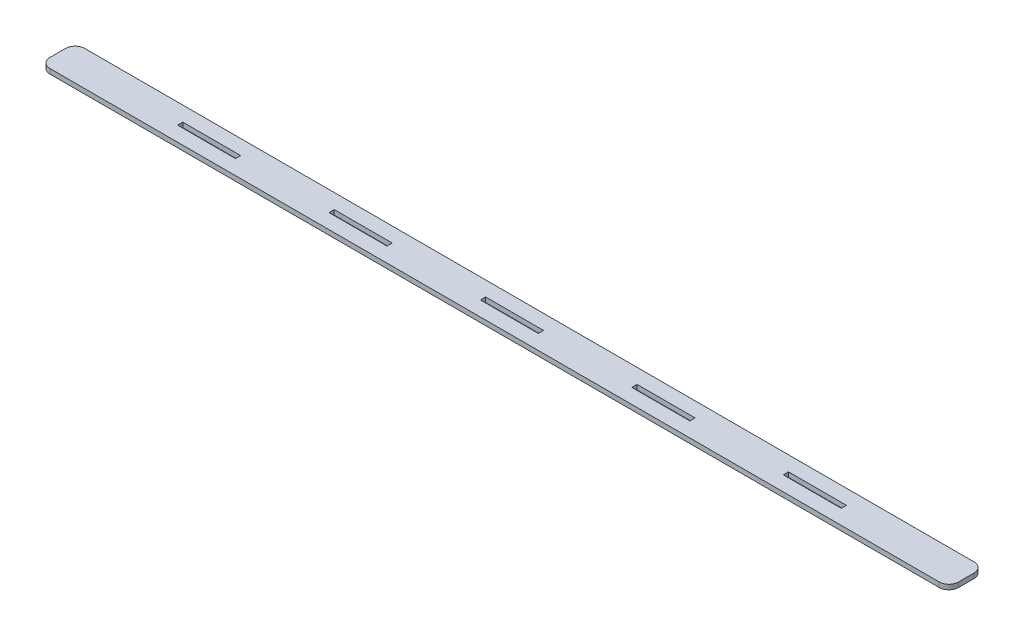
ISO-10303-21;
HEADER;
FILE_DESCRIPTION(('STEP AP214'),'2;1');
FILE_NAME('part.step','',(''),(''),'','','');
FILE_SCHEMA(('AUTOMOTIVE_DESIGN { 1 0 10303 214 1 1 1 1 }'));
ENDSEC;
DATA;
#1=APPLICATION_CONTEXT('core data for automotive mechanical design processes');
#2=APPLICATION_PROTOCOL_DEFINITION('international standard','automotive_design',2000,#1);
#3=PRODUCT_CONTEXT('',#1,'mechanical');
#4=PRODUCT('Part','Part','',(#3));
#5=PRODUCT_RELATED_PRODUCT_CATEGORY('part','',(#4));
#6=PRODUCT_DEFINITION_FORMATION('','',#4);
#7=PRODUCT_DEFINITION_CONTEXT('part definition',#1,'design');
#8=PRODUCT_DEFINITION('design','',#6,#7);
#9=PRODUCT_DEFINITION_SHAPE('','',#8);
#10=(LENGTH_UNIT() NAMED_UNIT(*) SI_UNIT(.MILLI.,.METRE.));
#11=(NAMED_UNIT(*) PLANE_ANGLE_UNIT() SI_UNIT($,.RADIAN.));
#12=(NAMED_UNIT(*) SI_UNIT($,.STERADIAN.) SOLID_ANGLE_UNIT());
#13=UNCERTAINTY_MEASURE_WITH_UNIT(LENGTH_MEASURE(1.E-05),#10,'distance_accuracy_value','');
#14=(GEOMETRIC_REPRESENTATION_CONTEXT(3) GLOBAL_UNCERTAINTY_ASSIGNED_CONTEXT((#13)) GLOBAL_UNIT_ASSIGNED_CONTEXT((#10,
#11,#12)) REPRESENTATION_CONTEXT('',''));
#15=CARTESIAN_POINT('',(0.,0.,0.));
#16=DIRECTION('',(0.,0.,1.));
#17=DIRECTION('',(1.,0.,0.));
#18=AXIS2_PLACEMENT_3D('',#15,#16,#17);
#19=CARTESIAN_POINT('',(-298.45,3.175,11.43));
#20=DIRECTION('',(1.,0.,0.));
#21=DIRECTION('',(0.,0.,-1.));
#22=AXIS2_PLACEMENT_3D('',#19,#20,#21);
#23=PLANE('',#22);
#24=DIRECTION('',(0.,0.,1.));
#25=VECTOR('',#24,1.);
#26=CARTESIAN_POINT('',(-298.45,0.,11.43));
#27=LINE('',#26,#25);
#28=CARTESIAN_POINT('',(-298.45,0.,-5.07999999999997));
#29=VERTEX_POINT('',#28);
#30=CARTESIAN_POINT('',(-298.45,0.,5.08000000000003));
#31=VERTEX_POINT('',#30);
#32=EDGE_CURVE('E266',#29,#31,#27,.T.);
#33=ORIENTED_EDGE('',*,*,#32,.T.);
#34=DIRECTION('',(0.,-1.,0.));
#35=VECTOR('',#34,1.);
#36=CARTESIAN_POINT('',(-298.45,3.175,5.08000000000003));
#37=LINE('',#36,#35);
#38=CARTESIAN_POINT('',(-298.45,3.175,5.08000000000003));
#39=VERTEX_POINT('',#38);
#40=EDGE_CURVE('E11',#31,#39,#37,.F.);
#41=ORIENTED_EDGE('',*,*,#40,.T.);
#42=DIRECTION('',(0.,0.,1.));
#43=VECTOR('',#42,1.);
#44=CARTESIAN_POINT('',(-298.45,3.175,11.43));
#45=LINE('',#44,#43);
#46=CARTESIAN_POINT('',(-298.45,3.175,-5.07999999999997));
#47=VERTEX_POINT('',#46);
#48=EDGE_CURVE('E397',#47,#39,#45,.T.);
#49=ORIENTED_EDGE('',*,*,#48,.F.);
#50=DIRECTION('',(0.,-1.,0.));
#51=VECTOR('',#50,1.);
#52=CARTESIAN_POINT('',(-298.45,3.175,-5.07999999999997));
#53=LINE('',#52,#51);
#54=EDGE_CURVE('E47',#47,#29,#53,.T.);
#55=ORIENTED_EDGE('',*,*,#54,.T.);
#56=EDGE_LOOP('',(#33,#41,#49,#55));
#57=FACE_BOUND('',#56,.T.);
#58=ADVANCED_FACE('F39',(#57),#23,.F.);
#59=CARTESIAN_POINT('',(298.45,3.175,11.43));
#60=DIRECTION('',(0.,0.,-1.));
#61=DIRECTION('',(-1.,0.,0.));
#62=AXIS2_PLACEMENT_3D('',#59,#60,#61);
#63=PLANE('',#62);
#64=DIRECTION('',(1.,0.,0.));
#65=VECTOR('',#64,1.);
#66=CARTESIAN_POINT('',(298.45,0.,11.43));
#67=LINE('',#66,#65);
#68=CARTESIAN_POINT('',(-292.1,0.,11.43));
#69=VERTEX_POINT('',#68);
#70=CARTESIAN_POINT('',(292.1,0.,11.43));
#71=VERTEX_POINT('',#70);
#72=EDGE_CURVE('E411',#69,#71,#67,.T.);
#73=ORIENTED_EDGE('',*,*,#72,.T.);
#74=DIRECTION('',(0.,-1.,0.));
#75=VECTOR('',#74,1.);
#76=CARTESIAN_POINT('',(292.1,3.175,11.43));
#77=LINE('',#76,#75);
#78=CARTESIAN_POINT('',(292.1,3.175,11.43));
#79=VERTEX_POINT('',#78);
#80=EDGE_CURVE('E433',#71,#79,#77,.F.);
#81=ORIENTED_EDGE('',*,*,#80,.T.);
#82=DIRECTION('',(1.,0.,0.));
#83=VECTOR('',#82,1.);
#84=CARTESIAN_POINT('',(298.45,3.175,11.43));
#85=LINE('',#84,#83);
#86=CARTESIAN_POINT('',(-292.1,3.175,11.43));
#87=VERTEX_POINT('',#86);
#88=EDGE_CURVE('E400',#87,#79,#85,.T.);
#89=ORIENTED_EDGE('',*,*,#88,.F.);
#90=DIRECTION('',(0.,-1.,0.));
#91=VECTOR('',#90,1.);
#92=CARTESIAN_POINT('',(-292.1,3.175,11.43));
#93=LINE('',#92,#91);
#94=EDGE_CURVE('E430',#87,#69,#93,.T.);
#95=ORIENTED_EDGE('',*,*,#94,.T.);
#96=EDGE_LOOP('',(#73,#81,#89,#95));
#97=FACE_BOUND('',#96,.T.);
#98=ADVANCED_FACE('F463',(#97),#63,.F.);
#99=CARTESIAN_POINT('',(298.45,3.175,11.43));
#100=DIRECTION('',(-1.,0.,0.));
#101=DIRECTION('',(0.,0.,1.));
#102=AXIS2_PLACEMENT_3D('',#99,#100,#101);
#103=PLANE('',#102);
#104=DIRECTION('',(0.,0.,-1.));
#105=VECTOR('',#104,1.);
#106=CARTESIAN_POINT('',(298.45,3.175,11.43));
#107=LINE('',#106,#105);
#108=CARTESIAN_POINT('',(298.45,3.175,5.07999999999996));
#109=VERTEX_POINT('',#108);
#110=CARTESIAN_POINT('',(298.45,3.175,-5.08000000000004));
#111=VERTEX_POINT('',#110);
#112=EDGE_CURVE('E404',#109,#111,#107,.T.);
#113=ORIENTED_EDGE('',*,*,#112,.F.);
#114=DIRECTION('',(0.,-1.,0.));
#115=VECTOR('',#114,1.);
#116=CARTESIAN_POINT('',(298.45,3.175,5.07999999999996));
#117=LINE('',#116,#115);
#118=CARTESIAN_POINT('',(298.45,0.,5.07999999999996));
#119=VERTEX_POINT('',#118);
#120=EDGE_CURVE('E419',#109,#119,#117,.T.);
#121=ORIENTED_EDGE('',*,*,#120,.T.);
#122=DIRECTION('',(0.,0.,-1.));
#123=VECTOR('',#122,1.);
#124=CARTESIAN_POINT('',(298.45,0.,11.43));
#125=LINE('',#124,#123);
#126=CARTESIAN_POINT('',(298.45,0.,-5.08000000000004));
#127=VERTEX_POINT('',#126);
#128=EDGE_CURVE('E414',#119,#127,#125,.T.);
#129=ORIENTED_EDGE('',*,*,#128,.T.);
#130=DIRECTION('',(0.,-1.,0.));
#131=VECTOR('',#130,1.);
#132=CARTESIAN_POINT('',(298.45,3.175,-5.08000000000004));
#133=LINE('',#132,#131);
#134=EDGE_CURVE('E408',#127,#111,#133,.F.);
#135=ORIENTED_EDGE('',*,*,#134,.T.);
#136=EDGE_LOOP('',(#113,#121,#129,#135));
#137=FACE_BOUND('',#136,.T.);
#138=ADVANCED_FACE('F472',(#137),#103,.F.);
#139=CARTESIAN_POINT('',(298.45,3.175,-11.43));
#140=DIRECTION('',(0.,0.,1.));
#141=DIRECTION('',(1.,0.,0.));
#142=AXIS2_PLACEMENT_3D('',#139,#140,#141);
#143=PLANE('',#142);
#144=DIRECTION('',(-1.,0.,0.));
#145=VECTOR('',#144,1.);
#146=CARTESIAN_POINT('',(298.45,3.175,-11.43));
#147=LINE('',#146,#145);
#148=CARTESIAN_POINT('',(292.1,3.175,-11.43));
#149=VERTEX_POINT('',#148);
#150=CARTESIAN_POINT('',(-292.1,3.175,-11.43));
#151=VERTEX_POINT('',#150);
#152=EDGE_CURVE('E406',#149,#151,#147,.T.);
#153=ORIENTED_EDGE('',*,*,#152,.F.);
#154=DIRECTION('',(0.,-1.,0.));
#155=VECTOR('',#154,1.);
#156=CARTESIAN_POINT('',(292.1,3.175,-11.43));
#157=LINE('',#156,#155);
#158=CARTESIAN_POINT('',(292.1,0.,-11.43));
#159=VERTEX_POINT('',#158);
#160=EDGE_CURVE('E443',#149,#159,#157,.T.);
#161=ORIENTED_EDGE('',*,*,#160,.T.);
#162=DIRECTION('',(-1.,0.,0.));
#163=VECTOR('',#162,1.);
#164=CARTESIAN_POINT('',(298.45,0.,-11.43));
#165=LINE('',#164,#163);
#166=CARTESIAN_POINT('',(-292.1,0.,-11.43));
#167=VERTEX_POINT('',#166);
#168=EDGE_CURVE('E401',#159,#167,#165,.T.);
#169=ORIENTED_EDGE('',*,*,#168,.T.);
#170=DIRECTION('',(0.,-1.,0.));
#171=VECTOR('',#170,1.);
#172=CARTESIAN_POINT('',(-292.1,3.175,-11.43));
#173=LINE('',#172,#171);
#174=EDGE_CURVE('E54',#167,#151,#173,.F.);
#175=ORIENTED_EDGE('',*,*,#174,.T.);
#176=EDGE_LOOP('',(#153,#161,#169,#175));
#177=FACE_BOUND('',#176,.T.);
#178=ADVANCED_FACE('F477',(#177),#143,.F.);
#179=CARTESIAN_POINT('',(0.,3.175,0.));
#180=DIRECTION('',(0.,1.,0.));
#181=DIRECTION('',(0.,0.,1.));
#182=AXIS2_PLACEMENT_3D('',#179,#180,#181);
#183=PLANE('',#182);
#184=DIRECTION('',(0.,0.,-1.));
#185=VECTOR('',#184,1.);
#186=CARTESIAN_POINT('',(-179.916666582,3.175,1.7145));
#187=LINE('',#186,#185);
#188=CARTESIAN_POINT('',(-179.916666582,3.175,1.7145));
#189=VERTEX_POINT('',#188);
#190=CARTESIAN_POINT('',(-179.916666582,3.175,-1.7145));
#191=VERTEX_POINT('',#190);
#192=EDGE_CURVE('E232',#189,#191,#187,.T.);
#193=ORIENTED_EDGE('',*,*,#192,.F.);
#194=DIRECTION('',(1.,0.,0.));
#195=VECTOR('',#194,1.);
#196=CARTESIAN_POINT('',(-218.016666582,3.175,1.7145));
#197=LINE('',#196,#195);
#198=CARTESIAN_POINT('',(-218.016666582,3.175,1.7145));
#199=VERTEX_POINT('',#198);
#200=EDGE_CURVE('E250',#199,#189,#197,.T.);
#201=ORIENTED_EDGE('',*,*,#200,.F.);
#202=DIRECTION('',(0.,0.,1.));
#203=VECTOR('',#202,1.);
#204=CARTESIAN_POINT('',(-218.016666582,3.175,1.7145));
#205=LINE('',#204,#203);
#206=CARTESIAN_POINT('',(-218.016666582,3.175,-1.7145));
#207=VERTEX_POINT('',#206);
#208=EDGE_CURVE('E253',#207,#199,#205,.T.);
#209=ORIENTED_EDGE('',*,*,#208,.F.);
#210=DIRECTION('',(-1.,0.,0.));
#211=VECTOR('',#210,1.);
#212=CARTESIAN_POINT('',(-218.016666582,3.175,-1.7145));
#213=LINE('',#212,#211);
#214=EDGE_CURVE('E259',#191,#207,#213,.T.);
#215=ORIENTED_EDGE('',*,*,#214,.F.);
#216=EDGE_LOOP('',(#193,#201,#209,#215));
#217=FACE_BOUND('',#216,.T.);
#218=DIRECTION('',(0.,0.,-1.));
#219=VECTOR('',#218,1.);
#220=CARTESIAN_POINT('',(-80.4333331640002,3.175,1.7145));
#221=LINE('',#220,#219);
#222=CARTESIAN_POINT('',(-80.4333331640002,3.175,1.7145));
#223=VERTEX_POINT('',#222);
#224=CARTESIAN_POINT('',(-80.4333331640001,3.175,-1.7145));
#225=VERTEX_POINT('',#224);
#226=EDGE_CURVE('E284',#223,#225,#221,.T.);
#227=ORIENTED_EDGE('',*,*,#226,.F.);
#228=DIRECTION('',(1.,0.,0.));
#229=VECTOR('',#228,1.);
#230=CARTESIAN_POINT('',(-118.533333164,3.175,1.7145));
#231=LINE('',#230,#229);
#232=CARTESIAN_POINT('',(-118.533333164,3.175,1.7145));
#233=VERTEX_POINT('',#232);
#234=EDGE_CURVE('E274',#233,#223,#231,.T.);
#235=ORIENTED_EDGE('',*,*,#234,.F.);
#236=DIRECTION('',(0.,0.,1.));
#237=VECTOR('',#236,1.);
#238=CARTESIAN_POINT('',(-118.533333164,3.175,1.7145));
#239=LINE('',#238,#237);
#240=CARTESIAN_POINT('',(-118.533333164,3.175,-1.7145));
#241=VERTEX_POINT('',#240);
#242=EDGE_CURVE('E290',#241,#233,#239,.T.);
#243=ORIENTED_EDGE('',*,*,#242,.F.);
#244=DIRECTION('',(-1.,0.,0.));
#245=VECTOR('',#244,1.);
#246=CARTESIAN_POINT('',(-118.533333164,3.175,-1.7145));
#247=LINE('',#246,#245);
#248=EDGE_CURVE('E286',#225,#241,#247,.T.);
#249=ORIENTED_EDGE('',*,*,#248,.F.);
#250=EDGE_LOOP('',(#227,#235,#243,#249));
#251=FACE_BOUND('',#250,.T.);
#252=DIRECTION('',(0.,0.,-1.));
#253=VECTOR('',#252,1.);
#254=CARTESIAN_POINT('',(19.0500001693332,3.175,1.7145));
#255=LINE('',#254,#253);
#256=CARTESIAN_POINT('',(19.0500001693332,3.175,1.7145));
#257=VERTEX_POINT('',#256);
#258=CARTESIAN_POINT('',(19.0500001693332,3.175,-1.7145));
#259=VERTEX_POINT('',#258);
#260=EDGE_CURVE('E316',#257,#259,#255,.T.);
#261=ORIENTED_EDGE('',*,*,#260,.F.);
#262=DIRECTION('',(1.,0.,0.));
#263=VECTOR('',#262,1.);
#264=CARTESIAN_POINT('',(-19.0499998306668,3.175,1.7145));
#265=LINE('',#264,#263);
#266=CARTESIAN_POINT('',(-19.0499998306668,3.175,1.7145));
#267=VERTEX_POINT('',#266);
#268=EDGE_CURVE('E306',#267,#257,#265,.T.);
#269=ORIENTED_EDGE('',*,*,#268,.F.);
#270=DIRECTION('',(0.,0.,1.));
#271=VECTOR('',#270,1.);
#272=CARTESIAN_POINT('',(-19.0499998306668,3.175,1.7145));
#273=LINE('',#272,#271);
#274=CARTESIAN_POINT('',(-19.0499998306668,3.175,-1.7145));
#275=VERTEX_POINT('',#274);
#276=EDGE_CURVE('E322',#275,#267,#273,.T.);
#277=ORIENTED_EDGE('',*,*,#276,.F.);
#278=DIRECTION('',(-1.,0.,0.));
#279=VECTOR('',#278,1.);
#280=CARTESIAN_POINT('',(-19.0499998306668,3.175,-1.7145));
#281=LINE('',#280,#279);
#282=EDGE_CURVE('E318',#259,#275,#281,.T.);
#283=ORIENTED_EDGE('',*,*,#282,.F.);
#284=EDGE_LOOP('',(#261,#269,#277,#283));
#285=FACE_BOUND('',#284,.T.);
#286=DIRECTION('',(0.,0.,-1.));
#287=VECTOR('',#286,1.);
#288=CARTESIAN_POINT('',(118.533333333333,3.175,1.71449999999999));
#289=LINE('',#288,#287);
#290=CARTESIAN_POINT('',(118.533333333333,3.175,1.71449999999999));
#291=VERTEX_POINT('',#290);
#292=CARTESIAN_POINT('',(118.533333333333,3.175,-1.71450000000001));
#293=VERTEX_POINT('',#292);
#294=EDGE_CURVE('E348',#291,#293,#289,.T.);
#295=ORIENTED_EDGE('',*,*,#294,.F.);
#296=DIRECTION('',(1.,0.,0.));
#297=VECTOR('',#296,1.);
#298=CARTESIAN_POINT('',(80.4333333333333,3.175,1.7145));
#299=LINE('',#298,#297);
#300=CARTESIAN_POINT('',(80.4333333333333,3.175,1.7145));
#301=VERTEX_POINT('',#300);
#302=EDGE_CURVE('E338',#301,#291,#299,.T.);
#303=ORIENTED_EDGE('',*,*,#302,.F.);
#304=DIRECTION('',(0.,0.,1.));
#305=VECTOR('',#304,1.);
#306=CARTESIAN_POINT('',(80.4333333333333,3.175,1.7145));
#307=LINE('',#306,#305);
#308=CARTESIAN_POINT('',(80.4333333333333,3.175,-1.7145));
#309=VERTEX_POINT('',#308);
#310=EDGE_CURVE('E354',#309,#301,#307,.T.);
#311=ORIENTED_EDGE('',*,*,#310,.F.);
#312=DIRECTION('',(-1.,0.,0.));
#313=VECTOR('',#312,1.);
#314=CARTESIAN_POINT('',(80.4333333333333,3.175,-1.7145));
#315=LINE('',#314,#313);
#316=EDGE_CURVE('E350',#293,#309,#315,.T.);
#317=ORIENTED_EDGE('',*,*,#316,.F.);
#318=EDGE_LOOP('',(#295,#303,#311,#317));
#319=FACE_BOUND('',#318,.T.);
#320=DIRECTION('',(0.,0.,-1.));
#321=VECTOR('',#320,1.);
#322=CARTESIAN_POINT('',(218.016666666667,3.175,1.71449999999999));
#323=LINE('',#322,#321);
#324=CARTESIAN_POINT('',(218.016666666667,3.175,1.71449999999999));
#325=VERTEX_POINT('',#324);
#326=CARTESIAN_POINT('',(218.016666666667,3.175,-1.71450000000001));
#327=VERTEX_POINT('',#326);
#328=EDGE_CURVE('E380',#325,#327,#323,.T.);
#329=ORIENTED_EDGE('',*,*,#328,.F.);
#330=DIRECTION('',(1.,0.,0.));
#331=VECTOR('',#330,1.);
#332=CARTESIAN_POINT('',(179.916666666667,3.175,1.71449999999999));
#333=LINE('',#332,#331);
#334=CARTESIAN_POINT('',(179.916666666667,3.175,1.71449999999999));
#335=VERTEX_POINT('',#334);
#336=EDGE_CURVE('E370',#335,#325,#333,.T.);
#337=ORIENTED_EDGE('',*,*,#336,.F.);
#338=DIRECTION('',(0.,0.,1.));
#339=VECTOR('',#338,1.);
#340=CARTESIAN_POINT('',(179.916666666667,3.175,1.71449999999999));
#341=LINE('',#340,#339);
#342=CARTESIAN_POINT('',(179.916666666667,3.175,-1.71450000000001));
#343=VERTEX_POINT('',#342);
#344=EDGE_CURVE('E385',#343,#335,#341,.T.);
#345=ORIENTED_EDGE('',*,*,#344,.F.);
#346=DIRECTION('',(-1.,0.,0.));
#347=VECTOR('',#346,1.);
#348=CARTESIAN_POINT('',(179.916666666667,3.175,-1.71450000000001));
#349=LINE('',#348,#347);
#350=EDGE_CURVE('E382',#327,#343,#349,.T.);
#351=ORIENTED_EDGE('',*,*,#350,.F.);
#352=EDGE_LOOP('',(#329,#337,#345,#351));
#353=FACE_BOUND('',#352,.T.);
#354=ORIENTED_EDGE('',*,*,#88,.T.);
#355=CARTESIAN_POINT('',(292.1,3.175,5.07999999999996));
#356=DIRECTION('',(0.,1.,0.));
#357=DIRECTION('',(0.,0.,1.));
#358=AXIS2_PLACEMENT_3D('',#355,#356,#357);
#359=CIRCLE('',#358,6.35);
#360=EDGE_CURVE('E440',#79,#109,#359,.T.);
#361=ORIENTED_EDGE('',*,*,#360,.T.);
#362=ORIENTED_EDGE('',*,*,#112,.T.);
#363=CARTESIAN_POINT('',(292.1,3.175,-5.08000000000004));
#364=DIRECTION('',(0.,1.,0.));
#365=DIRECTION('',(0.,0.,1.));
#366=AXIS2_PLACEMENT_3D('',#363,#364,#365);
#367=CIRCLE('',#366,6.35);
#368=EDGE_CURVE('E61',#111,#149,#367,.T.);
#369=ORIENTED_EDGE('',*,*,#368,.T.);
#370=ORIENTED_EDGE('',*,*,#152,.T.);
#371=CARTESIAN_POINT('',(-292.1,3.175,-5.07999999999997));
#372=DIRECTION('',(0.,1.,0.));
#373=DIRECTION('',(0.,0.,1.));
#374=AXIS2_PLACEMENT_3D('',#371,#372,#373);
#375=CIRCLE('',#374,6.35);
#376=EDGE_CURVE('E435',#151,#47,#375,.T.);
#377=ORIENTED_EDGE('',*,*,#376,.T.);
#378=ORIENTED_EDGE('',*,*,#48,.T.);
#379=CARTESIAN_POINT('',(-292.1,3.175,5.08000000000003));
#380=DIRECTION('',(0.,1.,0.));
#381=DIRECTION('',(0.,0.,1.));
#382=AXIS2_PLACEMENT_3D('',#379,#380,#381);
#383=CIRCLE('',#382,6.35);
#384=EDGE_CURVE('E437',#39,#87,#383,.T.);
#385=ORIENTED_EDGE('',*,*,#384,.T.);
#386=EDGE_LOOP('',(#354,#361,#362,#369,#370,#377,#378,#385));
#387=FACE_BOUND('',#386,.T.);
#388=ADVANCED_FACE('F466',(#217,#251,#285,#319,#353,#387),#183,.T.);
#389=CARTESIAN_POINT('',(0.,0.,0.));
#390=DIRECTION('',(0.,1.,0.));
#391=DIRECTION('',(0.,0.,1.));
#392=AXIS2_PLACEMENT_3D('',#389,#390,#391);
#393=PLANE('',#392);
#394=DIRECTION('',(1.,0.,0.));
#395=VECTOR('',#394,1.);
#396=CARTESIAN_POINT('',(-218.016666582,0.,1.7145));
#397=LINE('',#396,#395);
#398=CARTESIAN_POINT('',(-218.016666582,0.,1.7145));
#399=VERTEX_POINT('',#398);
#400=CARTESIAN_POINT('',(-179.916666582,0.,1.7145));
#401=VERTEX_POINT('',#400);
#402=EDGE_CURVE('E237',#399,#401,#397,.T.);
#403=ORIENTED_EDGE('',*,*,#402,.T.);
#404=DIRECTION('',(0.,0.,-1.));
#405=VECTOR('',#404,1.);
#406=CARTESIAN_POINT('',(-179.916666582,0.,1.7145));
#407=LINE('',#406,#405);
#408=CARTESIAN_POINT('',(-179.916666582,0.,-1.7145));
#409=VERTEX_POINT('',#408);
#410=EDGE_CURVE('E229',#401,#409,#407,.T.);
#411=ORIENTED_EDGE('',*,*,#410,.T.);
#412=DIRECTION('',(-1.,0.,0.));
#413=VECTOR('',#412,1.);
#414=CARTESIAN_POINT('',(-218.016666582,0.,-1.7145));
#415=LINE('',#414,#413);
#416=CARTESIAN_POINT('',(-218.016666582,0.,-1.7145));
#417=VERTEX_POINT('',#416);
#418=EDGE_CURVE('E241',#409,#417,#415,.T.);
#419=ORIENTED_EDGE('',*,*,#418,.T.);
#420=DIRECTION('',(0.,0.,1.));
#421=VECTOR('',#420,1.);
#422=CARTESIAN_POINT('',(-218.016666582,0.,1.7145));
#423=LINE('',#422,#421);
#424=EDGE_CURVE('E245',#417,#399,#423,.T.);
#425=ORIENTED_EDGE('',*,*,#424,.T.);
#426=EDGE_LOOP('',(#403,#411,#419,#425));
#427=FACE_BOUND('',#426,.T.);
#428=DIRECTION('',(1.,0.,0.));
#429=VECTOR('',#428,1.);
#430=CARTESIAN_POINT('',(-118.533333164,0.,1.7145));
#431=LINE('',#430,#429);
#432=CARTESIAN_POINT('',(-118.533333164,0.,1.7145));
#433=VERTEX_POINT('',#432);
#434=CARTESIAN_POINT('',(-80.4333331640002,0.,1.7145));
#435=VERTEX_POINT('',#434);
#436=EDGE_CURVE('E280',#433,#435,#431,.T.);
#437=ORIENTED_EDGE('',*,*,#436,.T.);
#438=DIRECTION('',(0.,0.,-1.));
#439=VECTOR('',#438,1.);
#440=CARTESIAN_POINT('',(-80.4333331640002,0.,1.7145));
#441=LINE('',#440,#439);
#442=CARTESIAN_POINT('',(-80.4333331640001,0.,-1.7145));
#443=VERTEX_POINT('',#442);
#444=EDGE_CURVE('E270',#435,#443,#441,.T.);
#445=ORIENTED_EDGE('',*,*,#444,.T.);
#446=DIRECTION('',(-1.,0.,0.));
#447=VECTOR('',#446,1.);
#448=CARTESIAN_POINT('',(-118.533333164,0.,-1.7145));
#449=LINE('',#448,#447);
#450=CARTESIAN_POINT('',(-118.533333164,0.,-1.7145));
#451=VERTEX_POINT('',#450);
#452=EDGE_CURVE('E273',#443,#451,#449,.T.);
#453=ORIENTED_EDGE('',*,*,#452,.T.);
#454=DIRECTION('',(0.,0.,1.));
#455=VECTOR('',#454,1.);
#456=CARTESIAN_POINT('',(-118.533333164,0.,1.7145));
#457=LINE('',#456,#455);
#458=EDGE_CURVE('E277',#451,#433,#457,.T.);
#459=ORIENTED_EDGE('',*,*,#458,.T.);
#460=EDGE_LOOP('',(#437,#445,#453,#459));
#461=FACE_BOUND('',#460,.T.);
#462=DIRECTION('',(1.,0.,0.));
#463=VECTOR('',#462,1.);
#464=CARTESIAN_POINT('',(-19.0499998306668,0.,1.7145));
#465=LINE('',#464,#463);
#466=CARTESIAN_POINT('',(-19.0499998306668,0.,1.7145));
#467=VERTEX_POINT('',#466);
#468=CARTESIAN_POINT('',(19.0500001693332,0.,1.7145));
#469=VERTEX_POINT('',#468);
#470=EDGE_CURVE('E312',#467,#469,#465,.T.);
#471=ORIENTED_EDGE('',*,*,#470,.T.);
#472=DIRECTION('',(0.,0.,-1.));
#473=VECTOR('',#472,1.);
#474=CARTESIAN_POINT('',(19.0500001693332,0.,1.7145));
#475=LINE('',#474,#473);
#476=CARTESIAN_POINT('',(19.0500001693332,0.,-1.7145));
#477=VERTEX_POINT('',#476);
#478=EDGE_CURVE('E302',#469,#477,#475,.T.);
#479=ORIENTED_EDGE('',*,*,#478,.T.);
#480=DIRECTION('',(-1.,0.,0.));
#481=VECTOR('',#480,1.);
#482=CARTESIAN_POINT('',(-19.0499998306668,0.,-1.7145));
#483=LINE('',#482,#481);
#484=CARTESIAN_POINT('',(-19.0499998306668,0.,-1.7145));
#485=VERTEX_POINT('',#484);
#486=EDGE_CURVE('E305',#477,#485,#483,.T.);
#487=ORIENTED_EDGE('',*,*,#486,.T.);
#488=DIRECTION('',(0.,0.,1.));
#489=VECTOR('',#488,1.);
#490=CARTESIAN_POINT('',(-19.0499998306668,0.,1.7145));
#491=LINE('',#490,#489);
#492=EDGE_CURVE('E309',#485,#467,#491,.T.);
#493=ORIENTED_EDGE('',*,*,#492,.T.);
#494=EDGE_LOOP('',(#471,#479,#487,#493));
#495=FACE_BOUND('',#494,.T.);
#496=DIRECTION('',(1.,0.,0.));
#497=VECTOR('',#496,1.);
#498=CARTESIAN_POINT('',(80.4333333333333,0.,1.7145));
#499=LINE('',#498,#497);
#500=CARTESIAN_POINT('',(80.4333333333333,0.,1.7145));
#501=VERTEX_POINT('',#500);
#502=CARTESIAN_POINT('',(118.533333333333,0.,1.71449999999999));
#503=VERTEX_POINT('',#502);
#504=EDGE_CURVE('E344',#501,#503,#499,.T.);
#505=ORIENTED_EDGE('',*,*,#504,.T.);
#506=DIRECTION('',(0.,0.,-1.));
#507=VECTOR('',#506,1.);
#508=CARTESIAN_POINT('',(118.533333333333,0.,1.71449999999999));
#509=LINE('',#508,#507);
#510=CARTESIAN_POINT('',(118.533333333333,0.,-1.71450000000001));
#511=VERTEX_POINT('',#510);
#512=EDGE_CURVE('E334',#503,#511,#509,.T.);
#513=ORIENTED_EDGE('',*,*,#512,.T.);
#514=DIRECTION('',(-1.,0.,0.));
#515=VECTOR('',#514,1.);
#516=CARTESIAN_POINT('',(80.4333333333333,0.,-1.7145));
#517=LINE('',#516,#515);
#518=CARTESIAN_POINT('',(80.4333333333333,0.,-1.7145));
#519=VERTEX_POINT('',#518);
#520=EDGE_CURVE('E337',#511,#519,#517,.T.);
#521=ORIENTED_EDGE('',*,*,#520,.T.);
#522=DIRECTION('',(0.,0.,1.));
#523=VECTOR('',#522,1.);
#524=CARTESIAN_POINT('',(80.4333333333333,0.,1.7145));
#525=LINE('',#524,#523);
#526=EDGE_CURVE('E341',#519,#501,#525,.T.);
#527=ORIENTED_EDGE('',*,*,#526,.T.);
#528=EDGE_LOOP('',(#505,#513,#521,#527));
#529=FACE_BOUND('',#528,.T.);
#530=DIRECTION('',(1.,0.,0.));
#531=VECTOR('',#530,1.);
#532=CARTESIAN_POINT('',(179.916666666667,0.,1.71449999999999));
#533=LINE('',#532,#531);
#534=CARTESIAN_POINT('',(179.916666666667,0.,1.71449999999999));
#535=VERTEX_POINT('',#534);
#536=CARTESIAN_POINT('',(218.016666666667,0.,1.71449999999999));
#537=VERTEX_POINT('',#536);
#538=EDGE_CURVE('E376',#535,#537,#533,.T.);
#539=ORIENTED_EDGE('',*,*,#538,.T.);
#540=DIRECTION('',(0.,0.,-1.));
#541=VECTOR('',#540,1.);
#542=CARTESIAN_POINT('',(218.016666666667,0.,1.71449999999999));
#543=LINE('',#542,#541);
#544=CARTESIAN_POINT('',(218.016666666667,0.,-1.71450000000001));
#545=VERTEX_POINT('',#544);
#546=EDGE_CURVE('E366',#537,#545,#543,.T.);
#547=ORIENTED_EDGE('',*,*,#546,.T.);
#548=DIRECTION('',(-1.,0.,0.));
#549=VECTOR('',#548,1.);
#550=CARTESIAN_POINT('',(179.916666666667,0.,-1.71450000000001));
#551=LINE('',#550,#549);
#552=CARTESIAN_POINT('',(179.916666666667,0.,-1.71450000000001));
#553=VERTEX_POINT('',#552);
#554=EDGE_CURVE('E369',#545,#553,#551,.T.);
#555=ORIENTED_EDGE('',*,*,#554,.T.);
#556=DIRECTION('',(0.,0.,1.));
#557=VECTOR('',#556,1.);
#558=CARTESIAN_POINT('',(179.916666666667,0.,1.71449999999999));
#559=LINE('',#558,#557);
#560=EDGE_CURVE('E373',#553,#535,#559,.T.);
#561=ORIENTED_EDGE('',*,*,#560,.T.);
#562=EDGE_LOOP('',(#539,#547,#555,#561));
#563=FACE_BOUND('',#562,.T.);
#564=ORIENTED_EDGE('',*,*,#128,.F.);
#565=CARTESIAN_POINT('',(292.1,0.,5.07999999999996));
#566=DIRECTION('',(0.,1.,0.));
#567=DIRECTION('',(0.,0.,1.));
#568=AXIS2_PLACEMENT_3D('',#565,#566,#567);
#569=CIRCLE('',#568,6.35);
#570=EDGE_CURVE('E428',#119,#71,#569,.F.);
#571=ORIENTED_EDGE('',*,*,#570,.T.);
#572=ORIENTED_EDGE('',*,*,#72,.F.);
#573=CARTESIAN_POINT('',(-292.1,0.,5.08000000000003));
#574=DIRECTION('',(0.,1.,0.));
#575=DIRECTION('',(0.,0.,1.));
#576=AXIS2_PLACEMENT_3D('',#573,#574,#575);
#577=CIRCLE('',#576,6.35);
#578=EDGE_CURVE('E424',#69,#31,#577,.F.);
#579=ORIENTED_EDGE('',*,*,#578,.T.);
#580=ORIENTED_EDGE('',*,*,#32,.F.);
#581=CARTESIAN_POINT('',(-292.1,0.,-5.07999999999997));
#582=DIRECTION('',(0.,1.,0.));
#583=DIRECTION('',(0.,0.,1.));
#584=AXIS2_PLACEMENT_3D('',#581,#582,#583);
#585=CIRCLE('',#584,6.35);
#586=EDGE_CURVE('E422',#29,#167,#585,.F.);
#587=ORIENTED_EDGE('',*,*,#586,.T.);
#588=ORIENTED_EDGE('',*,*,#168,.F.);
#589=CARTESIAN_POINT('',(292.1,0.,-5.08000000000004));
#590=DIRECTION('',(0.,1.,0.));
#591=DIRECTION('',(0.,0.,1.));
#592=AXIS2_PLACEMENT_3D('',#589,#590,#591);
#593=CIRCLE('',#592,6.35);
#594=EDGE_CURVE('E426',#159,#127,#593,.F.);
#595=ORIENTED_EDGE('',*,*,#594,.T.);
#596=EDGE_LOOP('',(#564,#571,#572,#579,#580,#587,#588,#595));
#597=FACE_BOUND('',#596,.T.);
#598=ADVANCED_FACE('F247',(#427,#461,#495,#529,#563,#597),#393,.F.);
#599=CARTESIAN_POINT('',(218.016666666667,0.,1.71449999999999));
#600=DIRECTION('',(1.,0.,0.));
#601=DIRECTION('',(0.,0.,-1.));
#602=AXIS2_PLACEMENT_3D('',#599,#600,#601);
#603=PLANE('',#602);
#604=ORIENTED_EDGE('',*,*,#328,.T.);
#605=DIRECTION('',(0.,1.,0.));
#606=VECTOR('',#605,1.);
#607=CARTESIAN_POINT('',(218.016666666667,0.,-1.71450000000001));
#608=LINE('',#607,#606);
#609=EDGE_CURVE('E379',#545,#327,#608,.T.);
#610=ORIENTED_EDGE('',*,*,#609,.F.);
#611=ORIENTED_EDGE('',*,*,#546,.F.);
#612=DIRECTION('',(0.,1.,0.));
#613=VECTOR('',#612,1.);
#614=CARTESIAN_POINT('',(218.016666666667,0.,1.71449999999999));
#615=LINE('',#614,#613);
#616=EDGE_CURVE('E351',#537,#325,#615,.T.);
#617=ORIENTED_EDGE('',*,*,#616,.T.);
#618=EDGE_LOOP('',(#604,#610,#611,#617));
#619=FACE_BOUND('',#618,.T.);
#620=ADVANCED_FACE('F681',(#619),#603,.F.);
#621=CARTESIAN_POINT('',(179.916666666667,0.,1.71449999999999));
#622=DIRECTION('',(0.,0.,1.));
#623=DIRECTION('',(1.,0.,0.));
#624=AXIS2_PLACEMENT_3D('',#621,#622,#623);
#625=PLANE('',#624);
#626=ORIENTED_EDGE('',*,*,#336,.T.);
#627=ORIENTED_EDGE('',*,*,#616,.F.);
#628=ORIENTED_EDGE('',*,*,#538,.F.);
#629=DIRECTION('',(0.,1.,0.));
#630=VECTOR('',#629,1.);
#631=CARTESIAN_POINT('',(179.916666666667,0.,1.71449999999999));
#632=LINE('',#631,#630);
#633=EDGE_CURVE('E391',#535,#335,#632,.T.);
#634=ORIENTED_EDGE('',*,*,#633,.T.);
#635=EDGE_LOOP('',(#626,#627,#628,#634));
#636=FACE_BOUND('',#635,.T.);
#637=ADVANCED_FACE('F672',(#636),#625,.F.);
#638=CARTESIAN_POINT('',(179.916666666667,0.,1.71449999999999));
#639=DIRECTION('',(-1.,0.,0.));
#640=DIRECTION('',(0.,0.,1.));
#641=AXIS2_PLACEMENT_3D('',#638,#639,#640);
#642=PLANE('',#641);
#643=ORIENTED_EDGE('',*,*,#344,.T.);
#644=ORIENTED_EDGE('',*,*,#633,.F.);
#645=ORIENTED_EDGE('',*,*,#560,.F.);
#646=DIRECTION('',(0.,1.,0.));
#647=VECTOR('',#646,1.);
#648=CARTESIAN_POINT('',(179.916666666667,0.,-1.71450000000001));
#649=LINE('',#648,#647);
#650=EDGE_CURVE('E393',#553,#343,#649,.T.);
#651=ORIENTED_EDGE('',*,*,#650,.T.);
#652=EDGE_LOOP('',(#643,#644,#645,#651));
#653=FACE_BOUND('',#652,.T.);
#654=ADVANCED_FACE('F663',(#653),#642,.F.);
#655=CARTESIAN_POINT('',(179.916666666667,0.,-1.71450000000001));
#656=DIRECTION('',(0.,0.,-1.));
#657=DIRECTION('',(-1.,0.,0.));
#658=AXIS2_PLACEMENT_3D('',#655,#656,#657);
#659=PLANE('',#658);
#660=ORIENTED_EDGE('',*,*,#350,.T.);
#661=ORIENTED_EDGE('',*,*,#650,.F.);
#662=ORIENTED_EDGE('',*,*,#554,.F.);
#663=ORIENTED_EDGE('',*,*,#609,.T.);
#664=EDGE_LOOP('',(#660,#661,#662,#663));
#665=FACE_BOUND('',#664,.T.);
#666=ADVANCED_FACE('F654',(#665),#659,.F.);
#667=CARTESIAN_POINT('',(118.533333333333,0.,1.71449999999999));
#668=DIRECTION('',(1.,0.,0.));
#669=DIRECTION('',(0.,0.,-1.));
#670=AXIS2_PLACEMENT_3D('',#667,#668,#669);
#671=PLANE('',#670);
#672=ORIENTED_EDGE('',*,*,#294,.T.);
#673=DIRECTION('',(0.,1.,0.));
#674=VECTOR('',#673,1.);
#675=CARTESIAN_POINT('',(118.533333333333,0.,-1.71450000000001));
#676=LINE('',#675,#674);
#677=EDGE_CURVE('E347',#511,#293,#676,.T.);
#678=ORIENTED_EDGE('',*,*,#677,.F.);
#679=ORIENTED_EDGE('',*,*,#512,.F.);
#680=DIRECTION('',(0.,1.,0.));
#681=VECTOR('',#680,1.);
#682=CARTESIAN_POINT('',(118.533333333333,0.,1.71449999999999));
#683=LINE('',#682,#681);
#684=EDGE_CURVE('E319',#503,#291,#683,.T.);
#685=ORIENTED_EDGE('',*,*,#684,.T.);
#686=EDGE_LOOP('',(#672,#678,#679,#685));
#687=FACE_BOUND('',#686,.T.);
#688=ADVANCED_FACE('F645',(#687),#671,.F.);
#689=CARTESIAN_POINT('',(80.4333333333333,0.,1.7145));
#690=DIRECTION('',(0.,0.,1.));
#691=DIRECTION('',(1.,0.,0.));
#692=AXIS2_PLACEMENT_3D('',#689,#690,#691);
#693=PLANE('',#692);
#694=ORIENTED_EDGE('',*,*,#302,.T.);
#695=ORIENTED_EDGE('',*,*,#684,.F.);
#696=ORIENTED_EDGE('',*,*,#504,.F.);
#697=DIRECTION('',(0.,1.,0.));
#698=VECTOR('',#697,1.);
#699=CARTESIAN_POINT('',(80.4333333333333,0.,1.7145));
#700=LINE('',#699,#698);
#701=EDGE_CURVE('E360',#501,#301,#700,.T.);
#702=ORIENTED_EDGE('',*,*,#701,.T.);
#703=EDGE_LOOP('',(#694,#695,#696,#702));
#704=FACE_BOUND('',#703,.T.);
#705=ADVANCED_FACE('F636',(#704),#693,.F.);
#706=CARTESIAN_POINT('',(80.4333333333333,0.,1.7145));
#707=DIRECTION('',(-1.,0.,0.));
#708=DIRECTION('',(0.,0.,1.));
#709=AXIS2_PLACEMENT_3D('',#706,#707,#708);
#710=PLANE('',#709);
#711=ORIENTED_EDGE('',*,*,#310,.T.);
#712=ORIENTED_EDGE('',*,*,#701,.F.);
#713=ORIENTED_EDGE('',*,*,#526,.F.);
#714=DIRECTION('',(0.,1.,0.));
#715=VECTOR('',#714,1.);
#716=CARTESIAN_POINT('',(80.4333333333333,0.,-1.7145));
#717=LINE('',#716,#715);
#718=EDGE_CURVE('E362',#519,#309,#717,.T.);
#719=ORIENTED_EDGE('',*,*,#718,.T.);
#720=EDGE_LOOP('',(#711,#712,#713,#719));
#721=FACE_BOUND('',#720,.T.);
#722=ADVANCED_FACE('F627',(#721),#710,.F.);
#723=CARTESIAN_POINT('',(80.4333333333333,0.,-1.7145));
#724=DIRECTION('',(0.,0.,-1.));
#725=DIRECTION('',(-1.,0.,0.));
#726=AXIS2_PLACEMENT_3D('',#723,#724,#725);
#727=PLANE('',#726);
#728=ORIENTED_EDGE('',*,*,#316,.T.);
#729=ORIENTED_EDGE('',*,*,#718,.F.);
#730=ORIENTED_EDGE('',*,*,#520,.F.);
#731=ORIENTED_EDGE('',*,*,#677,.T.);
#732=EDGE_LOOP('',(#728,#729,#730,#731));
#733=FACE_BOUND('',#732,.T.);
#734=ADVANCED_FACE('F618',(#733),#727,.F.);
#735=CARTESIAN_POINT('',(19.0500001693332,0.,1.7145));
#736=DIRECTION('',(1.,0.,0.));
#737=DIRECTION('',(0.,0.,-1.));
#738=AXIS2_PLACEMENT_3D('',#735,#736,#737);
#739=PLANE('',#738);
#740=ORIENTED_EDGE('',*,*,#260,.T.);
#741=DIRECTION('',(0.,1.,0.));
#742=VECTOR('',#741,1.);
#743=CARTESIAN_POINT('',(19.0500001693332,0.,-1.7145));
#744=LINE('',#743,#742);
#745=EDGE_CURVE('E315',#477,#259,#744,.T.);
#746=ORIENTED_EDGE('',*,*,#745,.F.);
#747=ORIENTED_EDGE('',*,*,#478,.F.);
#748=DIRECTION('',(0.,1.,0.));
#749=VECTOR('',#748,1.);
#750=CARTESIAN_POINT('',(19.0500001693332,0.,1.7145));
#751=LINE('',#750,#749);
#752=EDGE_CURVE('E287',#469,#257,#751,.T.);
#753=ORIENTED_EDGE('',*,*,#752,.T.);
#754=EDGE_LOOP('',(#740,#746,#747,#753));
#755=FACE_BOUND('',#754,.T.);
#756=ADVANCED_FACE('F609',(#755),#739,.F.);
#757=CARTESIAN_POINT('',(-19.0499998306668,0.,1.7145));
#758=DIRECTION('',(0.,0.,1.));
#759=DIRECTION('',(1.,0.,0.));
#760=AXIS2_PLACEMENT_3D('',#757,#758,#759);
#761=PLANE('',#760);
#762=ORIENTED_EDGE('',*,*,#268,.T.);
#763=ORIENTED_EDGE('',*,*,#752,.F.);
#764=ORIENTED_EDGE('',*,*,#470,.F.);
#765=DIRECTION('',(0.,1.,0.));
#766=VECTOR('',#765,1.);
#767=CARTESIAN_POINT('',(-19.0499998306668,0.,1.7145));
#768=LINE('',#767,#766);
#769=EDGE_CURVE('E328',#467,#267,#768,.T.);
#770=ORIENTED_EDGE('',*,*,#769,.T.);
#771=EDGE_LOOP('',(#762,#763,#764,#770));
#772=FACE_BOUND('',#771,.T.);
#773=ADVANCED_FACE('F600',(#772),#761,.F.);
#774=CARTESIAN_POINT('',(-19.0499998306668,0.,1.7145));
#775=DIRECTION('',(-1.,0.,0.));
#776=DIRECTION('',(0.,0.,1.));
#777=AXIS2_PLACEMENT_3D('',#774,#775,#776);
#778=PLANE('',#777);
#779=ORIENTED_EDGE('',*,*,#276,.T.);
#780=ORIENTED_EDGE('',*,*,#769,.F.);
#781=ORIENTED_EDGE('',*,*,#492,.F.);
#782=DIRECTION('',(0.,1.,0.));
#783=VECTOR('',#782,1.);
#784=CARTESIAN_POINT('',(-19.0499998306668,0.,-1.7145));
#785=LINE('',#784,#783);
#786=EDGE_CURVE('E330',#485,#275,#785,.T.);
#787=ORIENTED_EDGE('',*,*,#786,.T.);
#788=EDGE_LOOP('',(#779,#780,#781,#787));
#789=FACE_BOUND('',#788,.T.);
#790=ADVANCED_FACE('F591',(#789),#778,.F.);
#791=CARTESIAN_POINT('',(-19.0499998306668,0.,-1.7145));
#792=DIRECTION('',(0.,0.,-1.));
#793=DIRECTION('',(-1.,0.,0.));
#794=AXIS2_PLACEMENT_3D('',#791,#792,#793);
#795=PLANE('',#794);
#796=ORIENTED_EDGE('',*,*,#282,.T.);
#797=ORIENTED_EDGE('',*,*,#786,.F.);
#798=ORIENTED_EDGE('',*,*,#486,.F.);
#799=ORIENTED_EDGE('',*,*,#745,.T.);
#800=EDGE_LOOP('',(#796,#797,#798,#799));
#801=FACE_BOUND('',#800,.T.);
#802=ADVANCED_FACE('F582',(#801),#795,.F.);
#803=CARTESIAN_POINT('',(-80.4333331640002,0.,1.7145));
#804=DIRECTION('',(1.,0.,0.));
#805=DIRECTION('',(0.,0.,-1.));
#806=AXIS2_PLACEMENT_3D('',#803,#804,#805);
#807=PLANE('',#806);
#808=ORIENTED_EDGE('',*,*,#226,.T.);
#809=DIRECTION('',(0.,1.,0.));
#810=VECTOR('',#809,1.);
#811=CARTESIAN_POINT('',(-80.4333331640001,0.,-1.7145));
#812=LINE('',#811,#810);
#813=EDGE_CURVE('E283',#443,#225,#812,.T.);
#814=ORIENTED_EDGE('',*,*,#813,.F.);
#815=ORIENTED_EDGE('',*,*,#444,.F.);
#816=DIRECTION('',(0.,1.,0.));
#817=VECTOR('',#816,1.);
#818=CARTESIAN_POINT('',(-80.4333331640002,0.,1.7145));
#819=LINE('',#818,#817);
#820=EDGE_CURVE('E260',#435,#223,#819,.T.);
#821=ORIENTED_EDGE('',*,*,#820,.T.);
#822=EDGE_LOOP('',(#808,#814,#815,#821));
#823=FACE_BOUND('',#822,.T.);
#824=ADVANCED_FACE('F573',(#823),#807,.F.);
#825=CARTESIAN_POINT('',(-118.533333164,0.,1.7145));
#826=DIRECTION('',(0.,0.,1.));
#827=DIRECTION('',(1.,0.,0.));
#828=AXIS2_PLACEMENT_3D('',#825,#826,#827);
#829=PLANE('',#828);
#830=ORIENTED_EDGE('',*,*,#234,.T.);
#831=ORIENTED_EDGE('',*,*,#820,.F.);
#832=ORIENTED_EDGE('',*,*,#436,.F.);
#833=DIRECTION('',(0.,1.,0.));
#834=VECTOR('',#833,1.);
#835=CARTESIAN_POINT('',(-118.533333164,0.,1.7145));
#836=LINE('',#835,#834);
#837=EDGE_CURVE('E296',#433,#233,#836,.T.);
#838=ORIENTED_EDGE('',*,*,#837,.T.);
#839=EDGE_LOOP('',(#830,#831,#832,#838));
#840=FACE_BOUND('',#839,.T.);
#841=ADVANCED_FACE('F564',(#840),#829,.F.);
#842=CARTESIAN_POINT('',(-118.533333164,0.,1.7145));
#843=DIRECTION('',(-1.,0.,0.));
#844=DIRECTION('',(0.,0.,1.));
#845=AXIS2_PLACEMENT_3D('',#842,#843,#844);
#846=PLANE('',#845);
#847=ORIENTED_EDGE('',*,*,#242,.T.);
#848=ORIENTED_EDGE('',*,*,#837,.F.);
#849=ORIENTED_EDGE('',*,*,#458,.F.);
#850=DIRECTION('',(0.,1.,0.));
#851=VECTOR('',#850,1.);
#852=CARTESIAN_POINT('',(-118.533333164,0.,-1.7145));
#853=LINE('',#852,#851);
#854=EDGE_CURVE('E298',#451,#241,#853,.T.);
#855=ORIENTED_EDGE('',*,*,#854,.T.);
#856=EDGE_LOOP('',(#847,#848,#849,#855));
#857=FACE_BOUND('',#856,.T.);
#858=ADVANCED_FACE('F555',(#857),#846,.F.);
#859=CARTESIAN_POINT('',(-118.533333164,0.,-1.7145));
#860=DIRECTION('',(0.,0.,-1.));
#861=DIRECTION('',(-1.,0.,0.));
#862=AXIS2_PLACEMENT_3D('',#859,#860,#861);
#863=PLANE('',#862);
#864=ORIENTED_EDGE('',*,*,#248,.T.);
#865=ORIENTED_EDGE('',*,*,#854,.F.);
#866=ORIENTED_EDGE('',*,*,#452,.F.);
#867=ORIENTED_EDGE('',*,*,#813,.T.);
#868=EDGE_LOOP('',(#864,#865,#866,#867));
#869=FACE_BOUND('',#868,.T.);
#870=ADVANCED_FACE('F547',(#869),#863,.F.);
#871=CARTESIAN_POINT('',(-179.916666582,0.,1.7145));
#872=DIRECTION('',(1.,0.,0.));
#873=DIRECTION('',(0.,0.,-1.));
#874=AXIS2_PLACEMENT_3D('',#871,#872,#873);
#875=PLANE('',#874);
#876=ORIENTED_EDGE('',*,*,#192,.T.);
#877=DIRECTION('',(0.,1.,0.));
#878=VECTOR('',#877,1.);
#879=CARTESIAN_POINT('',(-179.916666582,0.,-1.7145));
#880=LINE('',#879,#878);
#881=EDGE_CURVE('E225',#409,#191,#880,.T.);
#882=ORIENTED_EDGE('',*,*,#881,.F.);
#883=ORIENTED_EDGE('',*,*,#410,.F.);
#884=DIRECTION('',(0.,1.,0.));
#885=VECTOR('',#884,1.);
#886=CARTESIAN_POINT('',(-179.916666582,0.,1.7145));
#887=LINE('',#886,#885);
#888=EDGE_CURVE('E264',#401,#189,#887,.T.);
#889=ORIENTED_EDGE('',*,*,#888,.T.);
#890=EDGE_LOOP('',(#876,#882,#883,#889));
#891=FACE_BOUND('',#890,.T.);
#892=ADVANCED_FACE('F227',(#891),#875,.F.);
#893=CARTESIAN_POINT('',(-218.016666582,0.,1.7145));
#894=DIRECTION('',(0.,0.,1.));
#895=DIRECTION('',(1.,0.,0.));
#896=AXIS2_PLACEMENT_3D('',#893,#894,#895);
#897=PLANE('',#896);
#898=ORIENTED_EDGE('',*,*,#200,.T.);
#899=ORIENTED_EDGE('',*,*,#888,.F.);
#900=ORIENTED_EDGE('',*,*,#402,.F.);
#901=DIRECTION('',(0.,1.,0.));
#902=VECTOR('',#901,1.);
#903=CARTESIAN_POINT('',(-218.016666582,0.,1.7145));
#904=LINE('',#903,#902);
#905=EDGE_CURVE('E267',#399,#199,#904,.T.);
#906=ORIENTED_EDGE('',*,*,#905,.T.);
#907=EDGE_LOOP('',(#898,#899,#900,#906));
#908=FACE_BOUND('',#907,.T.);
#909=ADVANCED_FACE('F530',(#908),#897,.F.);
#910=CARTESIAN_POINT('',(-218.016666582,0.,1.7145));
#911=DIRECTION('',(-1.,0.,0.));
#912=DIRECTION('',(0.,0.,1.));
#913=AXIS2_PLACEMENT_3D('',#910,#911,#912);
#914=PLANE('',#913);
#915=ORIENTED_EDGE('',*,*,#208,.T.);
#916=ORIENTED_EDGE('',*,*,#905,.F.);
#917=ORIENTED_EDGE('',*,*,#424,.F.);
#918=DIRECTION('',(0.,1.,0.));
#919=VECTOR('',#918,1.);
#920=CARTESIAN_POINT('',(-218.016666582,0.,-1.7145));
#921=LINE('',#920,#919);
#922=EDGE_CURVE('E236',#417,#207,#921,.T.);
#923=ORIENTED_EDGE('',*,*,#922,.T.);
#924=EDGE_LOOP('',(#915,#916,#917,#923));
#925=FACE_BOUND('',#924,.T.);
#926=ADVANCED_FACE('F522',(#925),#914,.F.);
#927=CARTESIAN_POINT('',(-218.016666582,0.,-1.7145));
#928=DIRECTION('',(0.,0.,-1.));
#929=DIRECTION('',(-1.,0.,0.));
#930=AXIS2_PLACEMENT_3D('',#927,#928,#929);
#931=PLANE('',#930);
#932=ORIENTED_EDGE('',*,*,#214,.T.);
#933=ORIENTED_EDGE('',*,*,#922,.F.);
#934=ORIENTED_EDGE('',*,*,#418,.F.);
#935=ORIENTED_EDGE('',*,*,#881,.T.);
#936=EDGE_LOOP('',(#932,#933,#934,#935));
#937=FACE_BOUND('',#936,.T.);
#938=ADVANCED_FACE('F242',(#937),#931,.F.);
#939=CARTESIAN_POINT('',(292.1,3.175,5.07999999999996));
#940=DIRECTION('',(0.,-1.,0.));
#941=DIRECTION('',(0.,0.,-1.));
#942=AXIS2_PLACEMENT_3D('',#939,#940,#941);
#943=CYLINDRICAL_SURFACE('',#942,6.35);
#944=ORIENTED_EDGE('',*,*,#360,.F.);
#945=ORIENTED_EDGE('',*,*,#80,.F.);
#946=ORIENTED_EDGE('',*,*,#570,.F.);
#947=ORIENTED_EDGE('',*,*,#120,.F.);
#948=EDGE_LOOP('',(#944,#945,#946,#947));
#949=FACE_BOUND('',#948,.T.);
#950=ADVANCED_FACE('F470',(#949),#943,.T.);
#951=CARTESIAN_POINT('',(292.1,3.175,-5.08000000000004));
#952=DIRECTION('',(0.,-1.,0.));
#953=DIRECTION('',(0.,0.,-1.));
#954=AXIS2_PLACEMENT_3D('',#951,#952,#953);
#955=CYLINDRICAL_SURFACE('',#954,6.35);
#956=ORIENTED_EDGE('',*,*,#368,.F.);
#957=ORIENTED_EDGE('',*,*,#134,.F.);
#958=ORIENTED_EDGE('',*,*,#594,.F.);
#959=ORIENTED_EDGE('',*,*,#160,.F.);
#960=EDGE_LOOP('',(#956,#957,#958,#959));
#961=FACE_BOUND('',#960,.T.);
#962=ADVANCED_FACE('F476',(#961),#955,.T.);
#963=CARTESIAN_POINT('',(-292.1,3.175,5.08000000000003));
#964=DIRECTION('',(0.,-1.,0.));
#965=DIRECTION('',(0.,0.,-1.));
#966=AXIS2_PLACEMENT_3D('',#963,#964,#965);
#967=CYLINDRICAL_SURFACE('',#966,6.35);
#968=ORIENTED_EDGE('',*,*,#384,.F.);
#969=ORIENTED_EDGE('',*,*,#40,.F.);
#970=ORIENTED_EDGE('',*,*,#578,.F.);
#971=ORIENTED_EDGE('',*,*,#94,.F.);
#972=EDGE_LOOP('',(#968,#969,#970,#971));
#973=FACE_BOUND('',#972,.T.);
#974=ADVANCED_FACE('F460',(#973),#967,.T.);
#975=CARTESIAN_POINT('',(-292.1,3.175,-5.07999999999997));
#976=DIRECTION('',(0.,-1.,0.));
#977=DIRECTION('',(0.,0.,-1.));
#978=AXIS2_PLACEMENT_3D('',#975,#976,#977);
#979=CYLINDRICAL_SURFACE('',#978,6.35);
#980=ORIENTED_EDGE('',*,*,#376,.F.);
#981=ORIENTED_EDGE('',*,*,#174,.F.);
#982=ORIENTED_EDGE('',*,*,#586,.F.);
#983=ORIENTED_EDGE('',*,*,#54,.F.);
#984=EDGE_LOOP('',(#980,#981,#982,#983));
#985=FACE_BOUND('',#984,.T.);
#986=ADVANCED_FACE('F41',(#985),#979,.T.);
#987=CLOSED_SHELL('',(#58,#98,#138,#178,#388,#598,#620,#637,#654,#666,#688,#705,#722,#734,#756,
#773,#790,#802,#824,#841,#858,#870,#892,#909,#926,#938,#950,#962,#974,#986));
#988=MANIFOLD_SOLID_BREP('B2',#987);
#989=ADVANCED_BREP_SHAPE_REPRESENTATION('',(#18,#988),#14);
#990=SHAPE_DEFINITION_REPRESENTATION(#9,#989);
ENDSEC;
END-ISO-10303-21;
